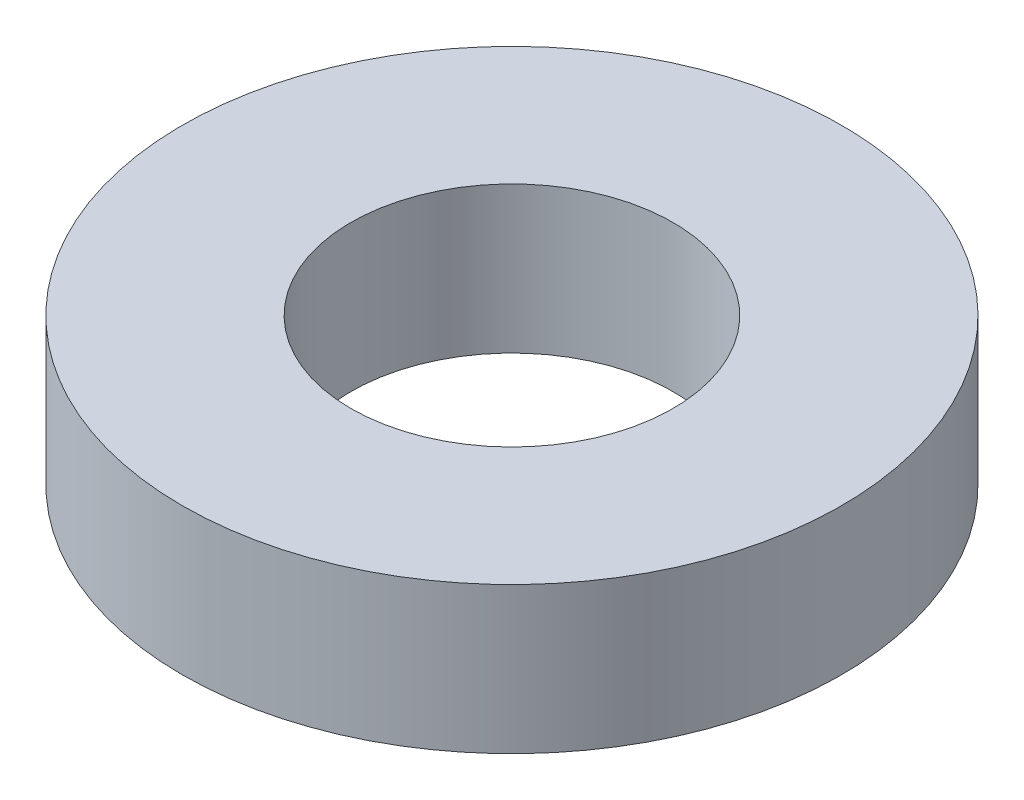
ISO-10303-21;
HEADER;
FILE_DESCRIPTION(('STEP AP214'),'2;1');
FILE_NAME('part.step','',(''),(''),'','','');
FILE_SCHEMA(('AUTOMOTIVE_DESIGN { 1 0 10303 214 1 1 1 1 }'));
ENDSEC;
DATA;
#1=APPLICATION_CONTEXT('core data for automotive mechanical design processes');
#2=APPLICATION_PROTOCOL_DEFINITION('international standard','automotive_design',2000,#1);
#3=PRODUCT_CONTEXT('',#1,'mechanical');
#4=PRODUCT('Part','Part','',(#3));
#5=PRODUCT_RELATED_PRODUCT_CATEGORY('part','',(#4));
#6=PRODUCT_DEFINITION_FORMATION('','',#4);
#7=PRODUCT_DEFINITION_CONTEXT('part definition',#1,'design');
#8=PRODUCT_DEFINITION('design','',#6,#7);
#9=PRODUCT_DEFINITION_SHAPE('','',#8);
#10=(LENGTH_UNIT() NAMED_UNIT(*) SI_UNIT(.MILLI.,.METRE.));
#11=(NAMED_UNIT(*) PLANE_ANGLE_UNIT() SI_UNIT($,.RADIAN.));
#12=(NAMED_UNIT(*) SI_UNIT($,.STERADIAN.) SOLID_ANGLE_UNIT());
#13=UNCERTAINTY_MEASURE_WITH_UNIT(LENGTH_MEASURE(1.E-05),#10,'distance_accuracy_value','');
#14=(GEOMETRIC_REPRESENTATION_CONTEXT(3) GLOBAL_UNCERTAINTY_ASSIGNED_CONTEXT((#13)) GLOBAL_UNIT_ASSIGNED_CONTEXT((#10,
#11,#12)) REPRESENTATION_CONTEXT('',''));
#15=CARTESIAN_POINT('',(0.,0.,0.));
#16=DIRECTION('',(0.,0.,1.));
#17=DIRECTION('',(1.,0.,0.));
#18=AXIS2_PLACEMENT_3D('',#15,#16,#17);
#19=CARTESIAN_POINT('',(-100.291651246,-60.,-25.));
#20=DIRECTION('',(0.,1.,0.));
#21=DIRECTION('',(0.,0.,1.));
#22=AXIS2_PLACEMENT_3D('',#19,#20,#21);
#23=PLANE('',#22);
#24=CARTESIAN_POINT('',(-100.291651246,-60.,-25.));
#25=DIRECTION('',(0.,1.,0.));
#26=DIRECTION('',(0.,0.,1.));
#27=AXIS2_PLACEMENT_3D('',#24,#25,#26);
#28=CIRCLE('',#27,4.5);
#29=CARTESIAN_POINT('',(-100.291651246,-60.,-20.5));
#30=VERTEX_POINT('',#29);
#31=EDGE_CURVE('E10',#30,#30,#28,.T.);
#32=ORIENTED_EDGE('',*,*,#31,.T.);
#33=EDGE_LOOP('',(#32));
#34=FACE_BOUND('',#33,.T.);
#35=CARTESIAN_POINT('',(-100.291651246,-60.,-25.));
#36=DIRECTION('',(0.,1.,0.));
#37=DIRECTION('',(0.,0.,1.));
#38=AXIS2_PLACEMENT_3D('',#35,#36,#37);
#39=CIRCLE('',#38,2.19999999999999);
#40=CARTESIAN_POINT('',(-100.291651246,-60.,-22.8));
#41=VERTEX_POINT('',#40);
#42=EDGE_CURVE('E49',#41,#41,#39,.T.);
#43=ORIENTED_EDGE('',*,*,#42,.F.);
#44=EDGE_LOOP('',(#43));
#45=FACE_BOUND('',#44,.T.);
#46=ADVANCED_FACE('F39',(#34,#45),#23,.T.);
#47=CARTESIAN_POINT('',(-100.291651246,-62.,-25.));
#48=DIRECTION('',(0.,1.,0.));
#49=DIRECTION('',(0.,0.,1.));
#50=AXIS2_PLACEMENT_3D('',#47,#48,#49);
#51=PLANE('',#50);
#52=CARTESIAN_POINT('',(-100.291651246,-62.,-25.));
#53=DIRECTION('',(0.,1.,0.));
#54=DIRECTION('',(0.,0.,1.));
#55=AXIS2_PLACEMENT_3D('',#52,#53,#54);
#56=CIRCLE('',#55,4.5);
#57=CARTESIAN_POINT('',(-100.291651246,-62.,-20.5));
#58=VERTEX_POINT('',#57);
#59=EDGE_CURVE('E43',#58,#58,#56,.T.);
#60=ORIENTED_EDGE('',*,*,#59,.F.);
#61=EDGE_LOOP('',(#60));
#62=FACE_BOUND('',#61,.T.);
#63=CARTESIAN_POINT('',(-100.291651246,-62.,-25.));
#64=DIRECTION('',(0.,1.,0.));
#65=DIRECTION('',(0.,0.,1.));
#66=AXIS2_PLACEMENT_3D('',#63,#64,#65);
#67=CIRCLE('',#66,2.19999999999999);
#68=CARTESIAN_POINT('',(-100.291651246,-62.,-22.8));
#69=VERTEX_POINT('',#68);
#70=EDGE_CURVE('E55',#69,#69,#67,.T.);
#71=ORIENTED_EDGE('',*,*,#70,.T.);
#72=EDGE_LOOP('',(#71));
#73=FACE_BOUND('',#72,.T.);
#74=ADVANCED_FACE('F61',(#62,#73),#51,.F.);
#75=CARTESIAN_POINT('',(-100.291651246,-60.,-25.));
#76=DIRECTION('',(0.,-1.,0.));
#77=DIRECTION('',(0.,0.,-1.));
#78=AXIS2_PLACEMENT_3D('',#75,#76,#77);
#79=CYLINDRICAL_SURFACE('',#78,4.5);
#80=ORIENTED_EDGE('',*,*,#31,.F.);
#81=EDGE_LOOP('',(#80));
#82=FACE_BOUND('',#81,.T.);
#83=ORIENTED_EDGE('',*,*,#59,.T.);
#84=EDGE_LOOP('',(#83));
#85=FACE_BOUND('',#84,.T.);
#86=ADVANCED_FACE('F41',(#82,#85),#79,.T.);
#87=CARTESIAN_POINT('',(-100.291651246,-60.,-25.));
#88=DIRECTION('',(0.,-1.,0.));
#89=DIRECTION('',(0.,0.,-1.));
#90=AXIS2_PLACEMENT_3D('',#87,#88,#89);
#91=CYLINDRICAL_SURFACE('',#90,2.19999999999999);
#92=ORIENTED_EDGE('',*,*,#42,.T.);
#93=EDGE_LOOP('',(#92));
#94=FACE_BOUND('',#93,.T.);
#95=ORIENTED_EDGE('',*,*,#70,.F.);
#96=EDGE_LOOP('',(#95));
#97=FACE_BOUND('',#96,.T.);
#98=ADVANCED_FACE('F59',(#94,#97),#91,.F.);
#99=CLOSED_SHELL('',(#46,#74,#86,#98));
#100=MANIFOLD_SOLID_BREP('B2',#99);
#101=ADVANCED_BREP_SHAPE_REPRESENTATION('',(#18,#100),#14);
#102=SHAPE_DEFINITION_REPRESENTATION(#9,#101);
ENDSEC;
END-ISO-10303-21;
